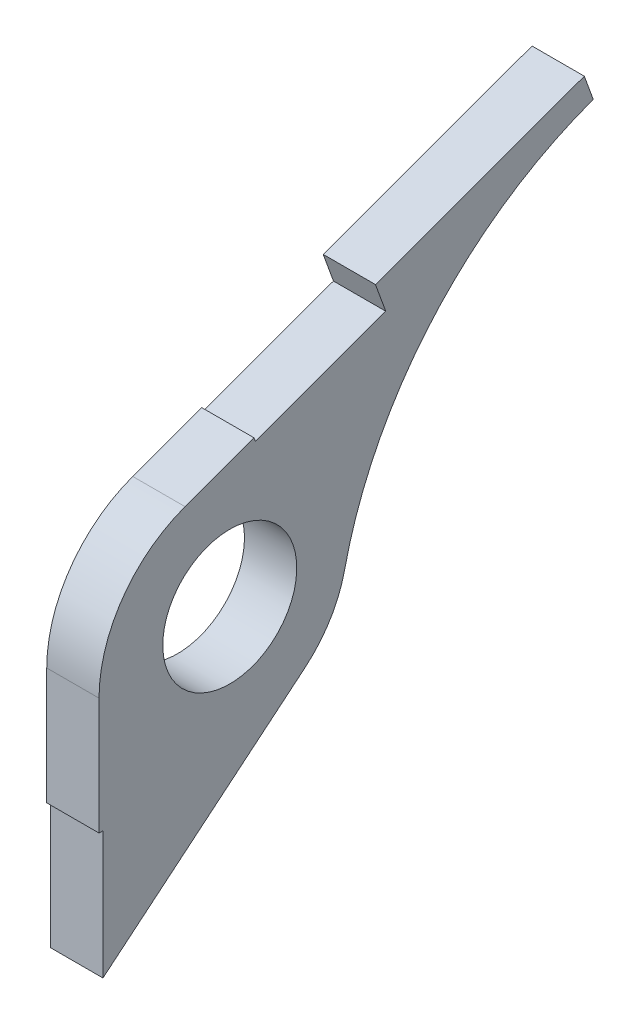
ISO-10303-21;
HEADER;
FILE_DESCRIPTION(('STEP AP214'),'2;1');
FILE_NAME('part.step','',(''),(''),'','','');
FILE_SCHEMA(('AUTOMOTIVE_DESIGN { 1 0 10303 214 1 1 1 1 }'));
ENDSEC;
DATA;
#1=APPLICATION_CONTEXT('core data for automotive mechanical design processes');
#2=APPLICATION_PROTOCOL_DEFINITION('international standard','automotive_design',2000,#1);
#3=PRODUCT_CONTEXT('',#1,'mechanical');
#4=PRODUCT('Part','Part','',(#3));
#5=PRODUCT_RELATED_PRODUCT_CATEGORY('part','',(#4));
#6=PRODUCT_DEFINITION_FORMATION('','',#4);
#7=PRODUCT_DEFINITION_CONTEXT('part definition',#1,'design');
#8=PRODUCT_DEFINITION('design','',#6,#7);
#9=PRODUCT_DEFINITION_SHAPE('','',#8);
#10=(LENGTH_UNIT() NAMED_UNIT(*) SI_UNIT(.MILLI.,.METRE.));
#11=(NAMED_UNIT(*) PLANE_ANGLE_UNIT() SI_UNIT($,.RADIAN.));
#12=(NAMED_UNIT(*) SI_UNIT($,.STERADIAN.) SOLID_ANGLE_UNIT());
#13=UNCERTAINTY_MEASURE_WITH_UNIT(LENGTH_MEASURE(1.E-05),#10,'distance_accuracy_value','');
#14=(GEOMETRIC_REPRESENTATION_CONTEXT(3) GLOBAL_UNCERTAINTY_ASSIGNED_CONTEXT((#13)) GLOBAL_UNIT_ASSIGNED_CONTEXT((#10,
#11,#12)) REPRESENTATION_CONTEXT('',''));
#15=CARTESIAN_POINT('',(0.,0.,0.));
#16=DIRECTION('',(0.,0.,1.));
#17=DIRECTION('',(1.,0.,0.));
#18=AXIS2_PLACEMENT_3D('',#15,#16,#17);
#19=CARTESIAN_POINT('',(195.3,107.401908362402,262.395309409204));
#20=DIRECTION('',(0.,0.342020143325663,-0.939692620785911));
#21=DIRECTION('',(0.,0.939692620785911,0.342020143325663));
#22=AXIS2_PLACEMENT_3D('',#19,#20,#21);
#23=PLANE('',#22);
#24=DIRECTION('',(0.,0.939692620785911,0.342020143325663));
#25=VECTOR('',#24,1.);
#26=CARTESIAN_POINT('',(191.3,107.401908362402,262.395309409204));
#27=LINE('',#26,#25);
#28=CARTESIAN_POINT('',(191.3,107.683816148638,262.497915452201));
#29=VERTEX_POINT('',#28);
#30=CARTESIAN_POINT('',(191.3,109.563201390209,263.181955738853));
#31=VERTEX_POINT('',#30);
#32=EDGE_CURVE('E159',#29,#31,#27,.T.);
#33=ORIENTED_EDGE('',*,*,#32,.T.);
#34=DIRECTION('',(-1.,0.,0.));
#35=VECTOR('',#34,1.);
#36=CARTESIAN_POINT('',(195.3,109.563201390209,263.181955738853));
#37=LINE('',#36,#35);
#38=CARTESIAN_POINT('',(195.3,109.563201390209,263.181955738853));
#39=VERTEX_POINT('',#38);
#40=EDGE_CURVE('E52',#39,#31,#37,.T.);
#41=ORIENTED_EDGE('',*,*,#40,.F.);
#42=DIRECTION('',(0.,0.939692620785911,0.342020143325663));
#43=VECTOR('',#42,1.);
#44=CARTESIAN_POINT('',(195.3,107.401908362402,262.395309409204));
#45=LINE('',#44,#43);
#46=CARTESIAN_POINT('',(195.3,107.683816148638,262.497915452201));
#47=VERTEX_POINT('',#46);
#48=EDGE_CURVE('E179',#47,#39,#45,.T.);
#49=ORIENTED_EDGE('',*,*,#48,.F.);
#50=DIRECTION('',(1.,0.,0.));
#51=VECTOR('',#50,1.);
#52=CARTESIAN_POINT('',(191.3,107.683816148638,262.497915452201));
#53=LINE('',#52,#51);
#54=EDGE_CURVE('E192',#29,#47,#53,.T.);
#55=ORIENTED_EDGE('',*,*,#54,.F.);
#56=EDGE_LOOP('',(#33,#41,#49,#55));
#57=FACE_BOUND('',#56,.T.);
#58=ADVANCED_FACE('F35',(#57),#23,.T.);
#59=CARTESIAN_POINT('',(195.3,101.587565925866,278.370083962564));
#60=DIRECTION('',(0.,-0.342020143325663,0.939692620785911));
#61=DIRECTION('',(0.,-0.939692620785911,-0.342020143325663));
#62=AXIS2_PLACEMENT_3D('',#59,#60,#61);
#63=PLANE('',#62);
#64=DIRECTION('',(0.,0.939692620785911,0.342020143325663));
#65=VECTOR('',#64,1.);
#66=CARTESIAN_POINT('',(195.3,101.587565925866,278.370083962564));
#67=LINE('',#66,#65);
#68=CARTESIAN_POINT('',(195.3,101.587565925866,278.370083962564));
#69=VERTEX_POINT('',#68);
#70=CARTESIAN_POINT('',(195.3,103.748858953673,279.156730292213));
#71=VERTEX_POINT('',#70);
#72=EDGE_CURVE('E145',#69,#71,#67,.T.);
#73=ORIENTED_EDGE('',*,*,#72,.T.);
#74=DIRECTION('',(1.,0.,0.));
#75=VECTOR('',#74,1.);
#76=CARTESIAN_POINT('',(191.3,103.748858953673,279.156730292213));
#77=LINE('',#76,#75);
#78=CARTESIAN_POINT('',(191.3,103.748858953673,279.156730292213));
#79=VERTEX_POINT('',#78);
#80=EDGE_CURVE('E132',#79,#71,#77,.T.);
#81=ORIENTED_EDGE('',*,*,#80,.F.);
#82=DIRECTION('',(0.,0.939692620785911,0.342020143325663));
#83=VECTOR('',#82,1.);
#84=CARTESIAN_POINT('',(191.3,101.587565925866,278.370083962564));
#85=LINE('',#84,#83);
#86=CARTESIAN_POINT('',(191.3,101.587565925866,278.370083962564));
#87=VERTEX_POINT('',#86);
#88=EDGE_CURVE('E143',#87,#79,#85,.T.);
#89=ORIENTED_EDGE('',*,*,#88,.F.);
#90=DIRECTION('',(1.,0.,0.));
#91=VECTOR('',#90,1.);
#92=CARTESIAN_POINT('',(195.3,101.587565925866,278.370083962564));
#93=LINE('',#92,#91);
#94=EDGE_CURVE('E163',#87,#69,#93,.T.);
#95=ORIENTED_EDGE('',*,*,#94,.T.);
#96=EDGE_LOOP('',(#73,#81,#89,#95));
#97=FACE_BOUND('',#96,.T.);
#98=ADVANCED_FACE('F141',(#97),#63,.T.);
#99=CARTESIAN_POINT('',(195.3,79.4930375250604,252.237311152431));
#100=DIRECTION('',(-1.,0.,0.));
#101=DIRECTION('',(0.,-1.,0.));
#102=AXIS2_PLACEMENT_3D('',#99,#100,#101);
#103=PLANE('',#102);
#104=CARTESIAN_POINT('',(195.3,87.9866537043276,290.301184893806));
#105=DIRECTION('',(1.,0.,0.));
#106=DIRECTION('',(0.,1.,0.));
#107=AXIS2_PLACEMENT_3D('',#104,#105,#106);
#108=CIRCLE('',#107,5.125);
#109=CARTESIAN_POINT('',(195.3,93.1116537043276,290.301184893806));
#110=VERTEX_POINT('',#109);
#111=EDGE_CURVE('E165',#110,#110,#108,.T.);
#112=ORIENTED_EDGE('',*,*,#111,.F.);
#113=EDGE_LOOP('',(#112));
#114=FACE_BOUND('',#113,.T.);
#115=DIRECTION('',(0.,0.342020143325665,-0.93969262078591));
#116=VECTOR('',#115,1.);
#117=CARTESIAN_POINT('',(195.3,103.748858953673,279.156730292213));
#118=LINE('',#117,#116);
#119=EDGE_CURVE('E146',#71,#39,#118,.T.);
#120=ORIENTED_EDGE('',*,*,#119,.F.);
#121=ORIENTED_EDGE('',*,*,#72,.F.);
#122=DIRECTION('',(0.,0.342020143325663,-0.939692620785911));
#123=VECTOR('',#122,1.);
#124=CARTESIAN_POINT('',(195.3,107.401908362402,262.395309409204));
#125=LINE('',#124,#123);
#126=CARTESIAN_POINT('',(195.3,97.9583278859618,288.341333527025));
#127=VERTEX_POINT('',#126);
#128=EDGE_CURVE('E162',#127,#69,#125,.T.);
#129=ORIENTED_EDGE('',*,*,#128,.F.);
#130=DIRECTION('',(0.,-0.939692620785911,-0.342020143325663));
#131=VECTOR('',#130,1.);
#132=CARTESIAN_POINT('',(195.3,70.0494570486204,278.183335270253));
#133=LINE('',#132,#131);
#134=CARTESIAN_POINT('',(195.3,98.2402356721976,288.443939570023));
#135=VERTEX_POINT('',#134);
#136=EDGE_CURVE('E44',#135,#127,#133,.T.);
#137=ORIENTED_EDGE('',*,*,#136,.F.);
#138=DIRECTION('',(0.,-0.342020143325661,0.939692620785911));
#139=VECTOR('',#138,1.);
#140=CARTESIAN_POINT('',(195.3,96.3194021397108,293.721386327063));
#141=LINE('',#140,#139);
#142=CARTESIAN_POINT('',(195.3,96.3194021397108,293.721386327063));
#143=VERTEX_POINT('',#142);
#144=EDGE_CURVE('E39',#135,#143,#141,.T.);
#145=ORIENTED_EDGE('',*,*,#144,.T.);
#146=CARTESIAN_POINT('',(195.3,86.9224759318517,290.301184893806));
#147=DIRECTION('',(1.,0.,0.));
#148=DIRECTION('',(0.,1.,0.));
#149=AXIS2_PLACEMENT_3D('',#146,#147,#148);
#150=CIRCLE('',#149,10.);
#151=CARTESIAN_POINT('',(195.3,86.9224759318517,300.301184893806));
#152=VERTEX_POINT('',#151);
#153=EDGE_CURVE('E215',#143,#152,#150,.T.);
#154=ORIENTED_EDGE('',*,*,#153,.T.);
#155=DIRECTION('',(0.,-1.,0.));
#156=VECTOR('',#155,1.);
#157=CARTESIAN_POINT('',(195.3,67.9866537043276,300.301184893806));
#158=LINE('',#157,#156);
#159=CARTESIAN_POINT('',(195.3,77.9866537043276,300.301184893806));
#160=VERTEX_POINT('',#159);
#161=EDGE_CURVE('E212',#152,#160,#158,.T.);
#162=ORIENTED_EDGE('',*,*,#161,.T.);
#163=DIRECTION('',(0.,0.,-1.));
#164=VECTOR('',#163,1.);
#165=CARTESIAN_POINT('',(195.3,77.9866537043276,252.237311152431));
#166=LINE('',#165,#164);
#167=CARTESIAN_POINT('',(195.3,77.9866537043276,300.001184893806));
#168=VERTEX_POINT('',#167);
#169=EDGE_CURVE('E211',#160,#168,#166,.T.);
#170=ORIENTED_EDGE('',*,*,#169,.T.);
#171=DIRECTION('',(0.,1.,0.));
#172=VECTOR('',#171,1.);
#173=CARTESIAN_POINT('',(195.3,79.4930375250604,300.001184893806));
#174=LINE('',#173,#172);
#175=CARTESIAN_POINT('',(195.3,68.2357262504203,300.001184893806));
#176=VERTEX_POINT('',#175);
#177=EDGE_CURVE('E173',#176,#168,#174,.T.);
#178=ORIENTED_EDGE('',*,*,#177,.F.);
#179=DIRECTION('',(0.,0.638779579618349,-0.769389789809175));
#180=VECTOR('',#179,1.);
#181=CARTESIAN_POINT('',(195.3,67.9866537043276,300.301184893806));
#182=LINE('',#181,#180);
#183=CARTESIAN_POINT('',(195.3,81.0621455960451,284.552168677241));
#184=VERTEX_POINT('',#183);
#185=EDGE_CURVE('E209',#176,#184,#182,.T.);
#186=ORIENTED_EDGE('',*,*,#185,.T.);
#187=CARTESIAN_POINT('',(195.3,87.9866537043276,290.301184893806));
#188=DIRECTION('',(1.,0.,0.));
#189=DIRECTION('',(0.,-1.,0.));
#190=AXIS2_PLACEMENT_3D('',#187,#188,#189);
#191=CIRCLE('',#190,8.99999999999998);
#192=CARTESIAN_POINT('',(195.3,86.026588432189,281.517214030412));
#193=VERTEX_POINT('',#192);
#194=EDGE_CURVE('E189',#184,#193,#191,.T.);
#195=ORIENTED_EDGE('',*,*,#194,.T.);
#196=CARTESIAN_POINT('',(195.3,79.4930375250604,252.237311152431));
#197=DIRECTION('',(-1.,0.,0.));
#198=DIRECTION('',(0.,-1.,0.));
#199=AXIS2_PLACEMENT_3D('',#196,#197,#198);
#200=CIRCLE('',#199,30.);
#201=EDGE_CURVE('E186',#193,#47,#200,.T.);
#202=ORIENTED_EDGE('',*,*,#201,.T.);
#203=ORIENTED_EDGE('',*,*,#48,.T.);
#204=EDGE_LOOP('',(#120,#121,#129,#137,#145,#154,#162,#170,#178,#186,#195,#202,#203));
#205=FACE_BOUND('',#204,.T.);
#206=ADVANCED_FACE('F273',(#114,#205),#103,.F.);
#207=CARTESIAN_POINT('',(191.3,79.4930375250604,252.237311152431));
#208=DIRECTION('',(-1.,0.,0.));
#209=DIRECTION('',(0.,-1.,0.));
#210=AXIS2_PLACEMENT_3D('',#207,#208,#209);
#211=PLANE('',#210);
#212=CARTESIAN_POINT('',(191.3,87.9866537043276,290.301184893806));
#213=DIRECTION('',(1.,0.,0.));
#214=DIRECTION('',(0.,1.,0.));
#215=AXIS2_PLACEMENT_3D('',#212,#213,#214);
#216=CIRCLE('',#215,5.125);
#217=CARTESIAN_POINT('',(191.3,93.1116537043276,290.301184893806));
#218=VERTEX_POINT('',#217);
#219=EDGE_CURVE('E167',#218,#218,#216,.T.);
#220=ORIENTED_EDGE('',*,*,#219,.T.);
#221=EDGE_LOOP('',(#220));
#222=FACE_BOUND('',#221,.T.);
#223=ORIENTED_EDGE('',*,*,#88,.T.);
#224=DIRECTION('',(0.,-0.342020143325663,0.93969262078591));
#225=VECTOR('',#224,1.);
#226=CARTESIAN_POINT('',(191.3,109.563201390209,263.181955738853));
#227=LINE('',#226,#225);
#228=EDGE_CURVE('E129',#31,#79,#227,.T.);
#229=ORIENTED_EDGE('',*,*,#228,.F.);
#230=ORIENTED_EDGE('',*,*,#32,.F.);
#231=CARTESIAN_POINT('',(191.3,79.4930375250604,252.237311152431));
#232=DIRECTION('',(-1.,0.,0.));
#233=DIRECTION('',(0.,-1.,0.));
#234=AXIS2_PLACEMENT_3D('',#231,#232,#233);
#235=CIRCLE('',#234,30.);
#236=CARTESIAN_POINT('',(191.3,86.026588432189,281.517214030412));
#237=VERTEX_POINT('',#236);
#238=EDGE_CURVE('E195',#237,#29,#235,.T.);
#239=ORIENTED_EDGE('',*,*,#238,.F.);
#240=CARTESIAN_POINT('',(191.3,87.9866537043276,290.301184893806));
#241=DIRECTION('',(1.,0.,0.));
#242=DIRECTION('',(0.,-1.,0.));
#243=AXIS2_PLACEMENT_3D('',#240,#241,#242);
#244=CIRCLE('',#243,8.99999999999998);
#245=CARTESIAN_POINT('',(191.3,81.0621455960451,284.552168677241));
#246=VERTEX_POINT('',#245);
#247=EDGE_CURVE('E194',#246,#237,#244,.T.);
#248=ORIENTED_EDGE('',*,*,#247,.F.);
#249=DIRECTION('',(0.,0.638779579618349,-0.769389789809175));
#250=VECTOR('',#249,1.);
#251=CARTESIAN_POINT('',(191.3,67.9866537043276,300.301184893806));
#252=LINE('',#251,#250);
#253=CARTESIAN_POINT('',(191.3,68.2357262504203,300.001184893806));
#254=VERTEX_POINT('',#253);
#255=EDGE_CURVE('E203',#254,#246,#252,.T.);
#256=ORIENTED_EDGE('',*,*,#255,.F.);
#257=DIRECTION('',(0.,-1.,0.));
#258=VECTOR('',#257,1.);
#259=CARTESIAN_POINT('',(191.3,77.9866537043276,300.001184893806));
#260=LINE('',#259,#258);
#261=CARTESIAN_POINT('',(191.3,77.9866537043276,300.001184893806));
#262=VERTEX_POINT('',#261);
#263=EDGE_CURVE('E172',#262,#254,#260,.T.);
#264=ORIENTED_EDGE('',*,*,#263,.F.);
#265=DIRECTION('',(0.,0.,1.));
#266=VECTOR('',#265,1.);
#267=CARTESIAN_POINT('',(191.3,77.9866537043276,300.001184893806));
#268=LINE('',#267,#266);
#269=CARTESIAN_POINT('',(191.3,77.9866537043276,300.301184893806));
#270=VERTEX_POINT('',#269);
#271=EDGE_CURVE('E151',#262,#270,#268,.T.);
#272=ORIENTED_EDGE('',*,*,#271,.T.);
#273=DIRECTION('',(0.,-1.,0.));
#274=VECTOR('',#273,1.);
#275=CARTESIAN_POINT('',(191.3,67.9866537043276,300.301184893806));
#276=LINE('',#275,#274);
#277=CARTESIAN_POINT('',(191.3,86.9224759318517,300.301184893806));
#278=VERTEX_POINT('',#277);
#279=EDGE_CURVE('E176',#278,#270,#276,.T.);
#280=ORIENTED_EDGE('',*,*,#279,.F.);
#281=CARTESIAN_POINT('',(191.3,86.9224759318517,290.301184893806));
#282=DIRECTION('',(1.,0.,0.));
#283=DIRECTION('',(0.,1.,0.));
#284=AXIS2_PLACEMENT_3D('',#281,#282,#283);
#285=CIRCLE('',#284,10.);
#286=CARTESIAN_POINT('',(191.3,96.3194021397108,293.721386327063));
#287=VERTEX_POINT('',#286);
#288=EDGE_CURVE('E199',#287,#278,#285,.T.);
#289=ORIENTED_EDGE('',*,*,#288,.F.);
#290=DIRECTION('',(0.,-0.342020143325661,0.939692620785911));
#291=VECTOR('',#290,1.);
#292=CARTESIAN_POINT('',(191.3,96.3194021397108,293.721386327063));
#293=LINE('',#292,#291);
#294=CARTESIAN_POINT('',(191.3,98.2402356721976,288.443939570023));
#295=VERTEX_POINT('',#294);
#296=EDGE_CURVE('E177',#295,#287,#293,.T.);
#297=ORIENTED_EDGE('',*,*,#296,.F.);
#298=DIRECTION('',(0.,-0.939692620785911,-0.342020143325663));
#299=VECTOR('',#298,1.);
#300=CARTESIAN_POINT('',(191.3,70.0494570486204,278.183335270253));
#301=LINE('',#300,#299);
#302=CARTESIAN_POINT('',(191.3,97.9583278859618,288.341333527025));
#303=VERTEX_POINT('',#302);
#304=EDGE_CURVE('E59',#295,#303,#301,.T.);
#305=ORIENTED_EDGE('',*,*,#304,.T.);
#306=DIRECTION('',(0.,0.342020143325663,-0.939692620785911));
#307=VECTOR('',#306,1.);
#308=CARTESIAN_POINT('',(191.3,107.401908362402,262.395309409204));
#309=LINE('',#308,#307);
#310=EDGE_CURVE('E150',#303,#87,#309,.T.);
#311=ORIENTED_EDGE('',*,*,#310,.T.);
#312=EDGE_LOOP('',(#223,#229,#230,#239,#248,#256,#264,#272,#280,#289,#297,#305,#311));
#313=FACE_BOUND('',#312,.T.);
#314=ADVANCED_FACE('F149',(#222,#313),#211,.T.);
#315=CARTESIAN_POINT('',(191.3,79.4930375250604,252.237311152431));
#316=DIRECTION('',(1.,0.,0.));
#317=DIRECTION('',(0.,1.,0.));
#318=AXIS2_PLACEMENT_3D('',#315,#316,#317);
#319=CYLINDRICAL_SURFACE('',#318,30.);
#320=ORIENTED_EDGE('',*,*,#201,.F.);
#321=DIRECTION('',(1.,0.,0.));
#322=VECTOR('',#321,1.);
#323=CARTESIAN_POINT('',(191.3,86.026588432189,281.517214030412));
#324=LINE('',#323,#322);
#325=EDGE_CURVE('E204',#237,#193,#324,.T.);
#326=ORIENTED_EDGE('',*,*,#325,.F.);
#327=ORIENTED_EDGE('',*,*,#238,.T.);
#328=ORIENTED_EDGE('',*,*,#54,.T.);
#329=EDGE_LOOP('',(#320,#326,#327,#328));
#330=FACE_BOUND('',#329,.T.);
#331=ADVANCED_FACE('F304',(#330),#319,.F.);
#332=CARTESIAN_POINT('',(191.3,87.9866537043276,290.301184893806));
#333=DIRECTION('',(1.,0.,0.));
#334=DIRECTION('',(0.,1.,0.));
#335=AXIS2_PLACEMENT_3D('',#332,#333,#334);
#336=CYLINDRICAL_SURFACE('',#335,8.99999999999998);
#337=ORIENTED_EDGE('',*,*,#194,.F.);
#338=DIRECTION('',(1.,0.,0.));
#339=VECTOR('',#338,1.);
#340=CARTESIAN_POINT('',(191.3,81.0621455960451,284.552168677241));
#341=LINE('',#340,#339);
#342=EDGE_CURVE('E200',#246,#184,#341,.T.);
#343=ORIENTED_EDGE('',*,*,#342,.F.);
#344=ORIENTED_EDGE('',*,*,#247,.T.);
#345=ORIENTED_EDGE('',*,*,#325,.T.);
#346=EDGE_LOOP('',(#337,#343,#344,#345));
#347=FACE_BOUND('',#346,.T.);
#348=ADVANCED_FACE('F248',(#347),#336,.T.);
#349=CARTESIAN_POINT('',(191.3,67.9866537043276,300.301184893806));
#350=DIRECTION('',(0.,-0.769389789809175,-0.638779579618349));
#351=DIRECTION('',(0.,0.638779579618349,-0.769389789809175));
#352=AXIS2_PLACEMENT_3D('',#349,#350,#351);
#353=PLANE('',#352);
#354=ORIENTED_EDGE('',*,*,#185,.F.);
#355=DIRECTION('',(-1.,0.,0.));
#356=VECTOR('',#355,1.);
#357=CARTESIAN_POINT('',(191.3,68.2357262504203,300.001184893806));
#358=LINE('',#357,#356);
#359=EDGE_CURVE('E206',#176,#254,#358,.T.);
#360=ORIENTED_EDGE('',*,*,#359,.T.);
#361=ORIENTED_EDGE('',*,*,#255,.T.);
#362=ORIENTED_EDGE('',*,*,#342,.T.);
#363=EDGE_LOOP('',(#354,#360,#361,#362));
#364=FACE_BOUND('',#363,.T.);
#365=ADVANCED_FACE('F252',(#364),#353,.T.);
#366=CARTESIAN_POINT('',(0.,0.,300.001184893806));
#367=DIRECTION('',(0.,0.,1.));
#368=DIRECTION('',(1.,0.,0.));
#369=AXIS2_PLACEMENT_3D('',#366,#367,#368);
#370=PLANE('',#369);
#371=ORIENTED_EDGE('',*,*,#177,.T.);
#372=DIRECTION('',(-1.,0.,0.));
#373=VECTOR('',#372,1.);
#374=CARTESIAN_POINT('',(238.599999999999,77.9866537043276,300.001184893806));
#375=LINE('',#374,#373);
#376=EDGE_CURVE('E170',#168,#262,#375,.T.);
#377=ORIENTED_EDGE('',*,*,#376,.T.);
#378=ORIENTED_EDGE('',*,*,#263,.T.);
#379=ORIENTED_EDGE('',*,*,#359,.F.);
#380=EDGE_LOOP('',(#371,#377,#378,#379));
#381=FACE_BOUND('',#380,.T.);
#382=ADVANCED_FACE('F257',(#381),#370,.T.);
#383=CARTESIAN_POINT('',(238.599999999999,77.9866537043276,300.001184893806));
#384=DIRECTION('',(0.,1.,0.));
#385=DIRECTION('',(0.,0.,1.));
#386=AXIS2_PLACEMENT_3D('',#383,#384,#385);
#387=PLANE('',#386);
#388=DIRECTION('',(-1.,0.,0.));
#389=VECTOR('',#388,1.);
#390=CARTESIAN_POINT('',(191.3,77.9866537043276,300.301184893806));
#391=LINE('',#390,#389);
#392=EDGE_CURVE('E174',#160,#270,#391,.T.);
#393=ORIENTED_EDGE('',*,*,#392,.T.);
#394=ORIENTED_EDGE('',*,*,#271,.F.);
#395=ORIENTED_EDGE('',*,*,#376,.F.);
#396=ORIENTED_EDGE('',*,*,#169,.F.);
#397=EDGE_LOOP('',(#393,#394,#395,#396));
#398=FACE_BOUND('',#397,.T.);
#399=ADVANCED_FACE('F261',(#398),#387,.F.);
#400=CARTESIAN_POINT('',(191.3,67.9866537043276,300.301184893806));
#401=DIRECTION('',(0.,0.,1.));
#402=DIRECTION('',(1.,0.,0.));
#403=AXIS2_PLACEMENT_3D('',#400,#401,#402);
#404=PLANE('',#403);
#405=ORIENTED_EDGE('',*,*,#279,.T.);
#406=ORIENTED_EDGE('',*,*,#392,.F.);
#407=ORIENTED_EDGE('',*,*,#161,.F.);
#408=DIRECTION('',(1.,0.,0.));
#409=VECTOR('',#408,1.);
#410=CARTESIAN_POINT('',(191.3,86.9224759318517,300.301184893806));
#411=LINE('',#410,#409);
#412=EDGE_CURVE('E197',#278,#152,#411,.T.);
#413=ORIENTED_EDGE('',*,*,#412,.F.);
#414=EDGE_LOOP('',(#405,#406,#407,#413));
#415=FACE_BOUND('',#414,.T.);
#416=ADVANCED_FACE('F265',(#415),#404,.T.);
#417=CARTESIAN_POINT('',(191.3,86.9224759318517,290.301184893806));
#418=DIRECTION('',(1.,0.,0.));
#419=DIRECTION('',(0.,1.,0.));
#420=AXIS2_PLACEMENT_3D('',#417,#418,#419);
#421=CYLINDRICAL_SURFACE('',#420,10.);
#422=ORIENTED_EDGE('',*,*,#153,.F.);
#423=DIRECTION('',(1.,0.,0.));
#424=VECTOR('',#423,1.);
#425=CARTESIAN_POINT('',(191.3,96.3194021397108,293.721386327063));
#426=LINE('',#425,#424);
#427=EDGE_CURVE('E178',#287,#143,#426,.T.);
#428=ORIENTED_EDGE('',*,*,#427,.F.);
#429=ORIENTED_EDGE('',*,*,#288,.T.);
#430=ORIENTED_EDGE('',*,*,#412,.T.);
#431=EDGE_LOOP('',(#422,#428,#429,#430));
#432=FACE_BOUND('',#431,.T.);
#433=ADVANCED_FACE('F269',(#432),#421,.T.);
#434=CARTESIAN_POINT('',(191.3,87.9866537043276,290.301184893806));
#435=DIRECTION('',(1.,0.,0.));
#436=DIRECTION('',(0.,1.,0.));
#437=AXIS2_PLACEMENT_3D('',#434,#435,#436);
#438=CYLINDRICAL_SURFACE('',#437,5.125);
#439=ORIENTED_EDGE('',*,*,#219,.F.);
#440=EDGE_LOOP('',(#439));
#441=FACE_BOUND('',#440,.T.);
#442=ORIENTED_EDGE('',*,*,#111,.T.);
#443=EDGE_LOOP('',(#442));
#444=FACE_BOUND('',#443,.T.);
#445=ADVANCED_FACE('F278',(#441,#444),#438,.F.);
#446=CARTESIAN_POINT('',(0.,179.170498585947,65.2127283439182));
#447=DIRECTION('',(0.,0.939692620785911,0.342020143325663));
#448=DIRECTION('',(0.,-0.342020143325663,0.939692620785911));
#449=AXIS2_PLACEMENT_3D('',#446,#447,#448);
#450=PLANE('',#449);
#451=ORIENTED_EDGE('',*,*,#310,.F.);
#452=DIRECTION('',(-1.,0.,0.));
#453=VECTOR('',#452,1.);
#454=CARTESIAN_POINT('',(240.976349916508,97.9583278859618,288.341333527025));
#455=LINE('',#454,#453);
#456=EDGE_CURVE('E11',#127,#303,#455,.T.);
#457=ORIENTED_EDGE('',*,*,#456,.F.);
#458=ORIENTED_EDGE('',*,*,#128,.T.);
#459=ORIENTED_EDGE('',*,*,#94,.F.);
#460=EDGE_LOOP('',(#451,#457,#458,#459));
#461=FACE_BOUND('',#460,.T.);
#462=ADVANCED_FACE('F276',(#461),#450,.T.);
#463=CARTESIAN_POINT('',(191.3,96.3194021397108,293.721386327063));
#464=DIRECTION('',(0.,0.939692620785911,0.342020143325661));
#465=DIRECTION('',(0.,-0.342020143325661,0.939692620785911));
#466=AXIS2_PLACEMENT_3D('',#463,#464,#465);
#467=PLANE('',#466);
#468=ORIENTED_EDGE('',*,*,#144,.F.);
#469=DIRECTION('',(1.,0.,0.));
#470=VECTOR('',#469,1.);
#471=CARTESIAN_POINT('',(253.5,98.2402356721976,288.443939570023));
#472=LINE('',#471,#470);
#473=EDGE_CURVE('E154',#295,#135,#472,.T.);
#474=ORIENTED_EDGE('',*,*,#473,.F.);
#475=ORIENTED_EDGE('',*,*,#296,.T.);
#476=ORIENTED_EDGE('',*,*,#427,.T.);
#477=EDGE_LOOP('',(#468,#474,#475,#476));
#478=FACE_BOUND('',#477,.T.);
#479=ADVANCED_FACE('F271',(#478),#467,.T.);
#480=CARTESIAN_POINT('',(240.976349916508,97.9583278859618,288.341333527025));
#481=DIRECTION('',(0.,0.342020143325663,-0.93969262078591));
#482=DIRECTION('',(0.,0.939692620785911,0.342020143325663));
#483=AXIS2_PLACEMENT_3D('',#480,#481,#482);
#484=PLANE('',#483);
#485=ORIENTED_EDGE('',*,*,#473,.T.);
#486=ORIENTED_EDGE('',*,*,#136,.T.);
#487=ORIENTED_EDGE('',*,*,#456,.T.);
#488=ORIENTED_EDGE('',*,*,#304,.F.);
#489=EDGE_LOOP('',(#485,#486,#487,#488));
#490=FACE_BOUND('',#489,.T.);
#491=ADVANCED_FACE('F37',(#490),#484,.T.);
#492=CARTESIAN_POINT('',(0.,181.331791613754,65.9993746735672));
#493=DIRECTION('',(0.,0.939692620785911,0.342020143325663));
#494=DIRECTION('',(0.,-0.342020143325663,0.939692620785911));
#495=AXIS2_PLACEMENT_3D('',#492,#493,#494);
#496=PLANE('',#495);
#497=ORIENTED_EDGE('',*,*,#228,.T.);
#498=ORIENTED_EDGE('',*,*,#80,.T.);
#499=ORIENTED_EDGE('',*,*,#119,.T.);
#500=ORIENTED_EDGE('',*,*,#40,.T.);
#501=EDGE_LOOP('',(#497,#498,#499,#500));
#502=FACE_BOUND('',#501,.T.);
#503=ADVANCED_FACE('F131',(#502),#496,.T.);
#504=CLOSED_SHELL('',(#58,#98,#206,#314,#331,#348,#365,#382,#399,#416,#433,#445,#462,#479,#491,#503));
#505=MANIFOLD_SOLID_BREP('B2',#504);
#506=ADVANCED_BREP_SHAPE_REPRESENTATION('',(#18,#505),#14);
#507=SHAPE_DEFINITION_REPRESENTATION(#9,#506);
ENDSEC;
END-ISO-10303-21;
